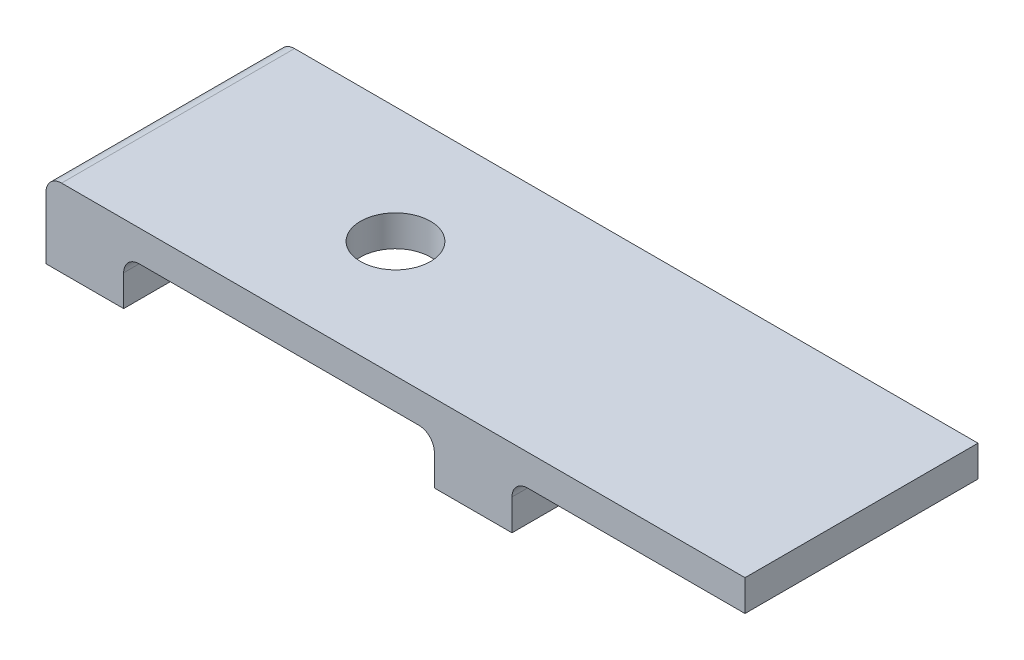
ISO-10303-21;
HEADER;
FILE_DESCRIPTION(('STEP AP214'),'2;1');
FILE_NAME('part.step','',(''),(''),'','','');
FILE_SCHEMA(('AUTOMOTIVE_DESIGN { 1 0 10303 214 1 1 1 1 }'));
ENDSEC;
DATA;
#1=APPLICATION_CONTEXT('core data for automotive mechanical design processes');
#2=APPLICATION_PROTOCOL_DEFINITION('international standard','automotive_design',2000,#1);
#3=PRODUCT_CONTEXT('',#1,'mechanical');
#4=PRODUCT('Part','Part','',(#3));
#5=PRODUCT_RELATED_PRODUCT_CATEGORY('part','',(#4));
#6=PRODUCT_DEFINITION_FORMATION('','',#4);
#7=PRODUCT_DEFINITION_CONTEXT('part definition',#1,'design');
#8=PRODUCT_DEFINITION('design','',#6,#7);
#9=PRODUCT_DEFINITION_SHAPE('','',#8);
#10=(LENGTH_UNIT() NAMED_UNIT(*) SI_UNIT(.MILLI.,.METRE.));
#11=(NAMED_UNIT(*) PLANE_ANGLE_UNIT() SI_UNIT($,.RADIAN.));
#12=(NAMED_UNIT(*) SI_UNIT($,.STERADIAN.) SOLID_ANGLE_UNIT());
#13=UNCERTAINTY_MEASURE_WITH_UNIT(LENGTH_MEASURE(1.E-05),#10,'distance_accuracy_value','');
#14=(GEOMETRIC_REPRESENTATION_CONTEXT(3) GLOBAL_UNCERTAINTY_ASSIGNED_CONTEXT((#13)) GLOBAL_UNIT_ASSIGNED_CONTEXT((#10,
#11,#12)) REPRESENTATION_CONTEXT('',''));
#15=CARTESIAN_POINT('',(0.,0.,0.));
#16=DIRECTION('',(0.,0.,1.));
#17=DIRECTION('',(1.,0.,0.));
#18=AXIS2_PLACEMENT_3D('',#15,#16,#17);
#19=CARTESIAN_POINT('',(31.,-3.,15.));
#20=DIRECTION('',(0.,0.,-1.));
#21=DIRECTION('',(-1.,0.,0.));
#22=AXIS2_PLACEMENT_3D('',#19,#20,#21);
#23=CYLINDRICAL_SURFACE('',#22,1.);
#24=DIRECTION('',(0.,0.,1.));
#25=VECTOR('',#24,1.);
#26=CARTESIAN_POINT('',(30.,-3.,15.));
#27=LINE('',#26,#25);
#28=CARTESIAN_POINT('',(30.,-3.,0.));
#29=VERTEX_POINT('',#28);
#30=CARTESIAN_POINT('',(30.,-3.,15.));
#31=VERTEX_POINT('',#30);
#32=EDGE_CURVE('E187',#29,#31,#27,.T.);
#33=ORIENTED_EDGE('',*,*,#32,.F.);
#34=CARTESIAN_POINT('',(31.,-3.,0.));
#35=DIRECTION('',(0.,0.,1.));
#36=DIRECTION('',(1.,0.,0.));
#37=AXIS2_PLACEMENT_3D('',#34,#35,#36);
#38=CIRCLE('',#37,1.);
#39=CARTESIAN_POINT('',(31.,-2.,0.));
#40=VERTEX_POINT('',#39);
#41=EDGE_CURVE('E39',#29,#40,#38,.F.);
#42=ORIENTED_EDGE('',*,*,#41,.T.);
#43=DIRECTION('',(0.,0.,1.));
#44=VECTOR('',#43,1.);
#45=CARTESIAN_POINT('',(31.,-2.,15.));
#46=LINE('',#45,#44);
#47=CARTESIAN_POINT('',(31.,-2.,15.));
#48=VERTEX_POINT('',#47);
#49=EDGE_CURVE('E190',#48,#40,#46,.F.);
#50=ORIENTED_EDGE('',*,*,#49,.F.);
#51=CARTESIAN_POINT('',(31.,-3.,15.));
#52=DIRECTION('',(0.,0.,1.));
#53=DIRECTION('',(1.,0.,0.));
#54=AXIS2_PLACEMENT_3D('',#51,#52,#53);
#55=CIRCLE('',#54,1.);
#56=EDGE_CURVE('E11',#48,#31,#55,.T.);
#57=ORIENTED_EDGE('',*,*,#56,.T.);
#58=EDGE_LOOP('',(#33,#42,#50,#57));
#59=FACE_BOUND('',#58,.T.);
#60=ADVANCED_FACE('F32',(#59),#23,.F.);
#61=CARTESIAN_POINT('',(24.,-3.,15.));
#62=DIRECTION('',(0.,0.,-1.));
#63=DIRECTION('',(-1.,0.,0.));
#64=AXIS2_PLACEMENT_3D('',#61,#62,#63);
#65=CYLINDRICAL_SURFACE('',#64,1.);
#66=DIRECTION('',(0.,0.,1.));
#67=VECTOR('',#66,1.);
#68=CARTESIAN_POINT('',(24.,-2.,15.));
#69=LINE('',#68,#67);
#70=CARTESIAN_POINT('',(24.,-2.,0.));
#71=VERTEX_POINT('',#70);
#72=CARTESIAN_POINT('',(24.,-2.,15.));
#73=VERTEX_POINT('',#72);
#74=EDGE_CURVE('E177',#71,#73,#69,.T.);
#75=ORIENTED_EDGE('',*,*,#74,.F.);
#76=CARTESIAN_POINT('',(24.,-3.,0.));
#77=DIRECTION('',(0.,0.,1.));
#78=DIRECTION('',(1.,0.,0.));
#79=AXIS2_PLACEMENT_3D('',#76,#77,#78);
#80=CIRCLE('',#79,1.);
#81=CARTESIAN_POINT('',(25.,-3.,0.));
#82=VERTEX_POINT('',#81);
#83=EDGE_CURVE('E183',#71,#82,#80,.F.);
#84=ORIENTED_EDGE('',*,*,#83,.T.);
#85=DIRECTION('',(0.,0.,1.));
#86=VECTOR('',#85,1.);
#87=CARTESIAN_POINT('',(25.,-3.,15.));
#88=LINE('',#87,#86);
#89=CARTESIAN_POINT('',(25.,-3.,15.));
#90=VERTEX_POINT('',#89);
#91=EDGE_CURVE('E180',#90,#82,#88,.F.);
#92=ORIENTED_EDGE('',*,*,#91,.F.);
#93=CARTESIAN_POINT('',(24.,-3.,15.));
#94=DIRECTION('',(0.,0.,1.));
#95=DIRECTION('',(1.,0.,0.));
#96=AXIS2_PLACEMENT_3D('',#93,#94,#95);
#97=CIRCLE('',#96,1.);
#98=EDGE_CURVE('E185',#90,#73,#97,.T.);
#99=ORIENTED_EDGE('',*,*,#98,.T.);
#100=EDGE_LOOP('',(#75,#84,#92,#99));
#101=FACE_BOUND('',#100,.T.);
#102=ADVANCED_FACE('F287',(#101),#65,.F.);
#103=CARTESIAN_POINT('',(6.,-3.,15.));
#104=DIRECTION('',(0.,0.,-1.));
#105=DIRECTION('',(-1.,0.,0.));
#106=AXIS2_PLACEMENT_3D('',#103,#104,#105);
#107=CYLINDRICAL_SURFACE('',#106,1.);
#108=DIRECTION('',(0.,0.,1.));
#109=VECTOR('',#108,1.);
#110=CARTESIAN_POINT('',(5.,-3.,15.));
#111=LINE('',#110,#109);
#112=CARTESIAN_POINT('',(5.,-3.,0.));
#113=VERTEX_POINT('',#112);
#114=CARTESIAN_POINT('',(5.,-3.,15.));
#115=VERTEX_POINT('',#114);
#116=EDGE_CURVE('E167',#113,#115,#111,.T.);
#117=ORIENTED_EDGE('',*,*,#116,.F.);
#118=CARTESIAN_POINT('',(6.,-3.,0.));
#119=DIRECTION('',(0.,0.,1.));
#120=DIRECTION('',(1.,0.,0.));
#121=AXIS2_PLACEMENT_3D('',#118,#119,#120);
#122=CIRCLE('',#121,1.);
#123=CARTESIAN_POINT('',(6.,-2.,0.));
#124=VERTEX_POINT('',#123);
#125=EDGE_CURVE('E173',#113,#124,#122,.F.);
#126=ORIENTED_EDGE('',*,*,#125,.T.);
#127=DIRECTION('',(0.,0.,1.));
#128=VECTOR('',#127,1.);
#129=CARTESIAN_POINT('',(6.,-2.,15.));
#130=LINE('',#129,#128);
#131=CARTESIAN_POINT('',(6.,-2.,15.));
#132=VERTEX_POINT('',#131);
#133=EDGE_CURVE('E170',#132,#124,#130,.F.);
#134=ORIENTED_EDGE('',*,*,#133,.F.);
#135=CARTESIAN_POINT('',(6.,-3.,15.));
#136=DIRECTION('',(0.,0.,1.));
#137=DIRECTION('',(1.,0.,0.));
#138=AXIS2_PLACEMENT_3D('',#135,#136,#137);
#139=CIRCLE('',#138,1.);
#140=EDGE_CURVE('E175',#132,#115,#139,.T.);
#141=ORIENTED_EDGE('',*,*,#140,.T.);
#142=EDGE_LOOP('',(#117,#126,#134,#141));
#143=FACE_BOUND('',#142,.T.);
#144=ADVANCED_FACE('F280',(#143),#107,.F.);
#145=CARTESIAN_POINT('',(1.,-1.,15.));
#146=DIRECTION('',(0.,0.,-1.));
#147=DIRECTION('',(-1.,0.,0.));
#148=AXIS2_PLACEMENT_3D('',#145,#146,#147);
#149=CYLINDRICAL_SURFACE('',#148,1.);
#150=DIRECTION('',(0.,0.,-1.));
#151=VECTOR('',#150,1.);
#152=CARTESIAN_POINT('',(0.,-1.,15.));
#153=LINE('',#152,#151);
#154=CARTESIAN_POINT('',(0.,-1.,15.));
#155=VERTEX_POINT('',#154);
#156=CARTESIAN_POINT('',(0.,-1.,0.));
#157=VERTEX_POINT('',#156);
#158=EDGE_CURVE('E154',#155,#157,#153,.T.);
#159=ORIENTED_EDGE('',*,*,#158,.F.);
#160=CARTESIAN_POINT('',(1.,-1.,15.));
#161=DIRECTION('',(0.,0.,1.));
#162=DIRECTION('',(1.,0.,0.));
#163=AXIS2_PLACEMENT_3D('',#160,#161,#162);
#164=CIRCLE('',#163,1.);
#165=CARTESIAN_POINT('',(1.,0.,15.));
#166=VERTEX_POINT('',#165);
#167=EDGE_CURVE('E134',#166,#155,#164,.T.);
#168=ORIENTED_EDGE('',*,*,#167,.F.);
#169=DIRECTION('',(0.,0.,-1.));
#170=VECTOR('',#169,1.);
#171=CARTESIAN_POINT('',(1.,0.,15.));
#172=LINE('',#171,#170);
#173=CARTESIAN_POINT('',(1.,0.,0.));
#174=VERTEX_POINT('',#173);
#175=EDGE_CURVE('E156',#174,#166,#172,.F.);
#176=ORIENTED_EDGE('',*,*,#175,.F.);
#177=CARTESIAN_POINT('',(1.,-1.,0.));
#178=DIRECTION('',(0.,0.,1.));
#179=DIRECTION('',(1.,0.,0.));
#180=AXIS2_PLACEMENT_3D('',#177,#178,#179);
#181=CIRCLE('',#180,1.);
#182=EDGE_CURVE('E165',#157,#174,#181,.F.);
#183=ORIENTED_EDGE('',*,*,#182,.F.);
#184=EDGE_LOOP('',(#159,#168,#176,#183));
#185=FACE_BOUND('',#184,.T.);
#186=ADVANCED_FACE('F278',(#185),#149,.T.);
#187=CARTESIAN_POINT('',(0.,0.,15.));
#188=DIRECTION('',(1.,0.,0.));
#189=DIRECTION('',(0.,1.,0.));
#190=AXIS2_PLACEMENT_3D('',#187,#188,#189);
#191=PLANE('',#190);
#192=DIRECTION('',(0.,-1.,0.));
#193=VECTOR('',#192,1.);
#194=CARTESIAN_POINT('',(0.,0.,15.));
#195=LINE('',#194,#193);
#196=CARTESIAN_POINT('',(0.,-5.,15.));
#197=VERTEX_POINT('',#196);
#198=EDGE_CURVE('E127',#155,#197,#195,.T.);
#199=ORIENTED_EDGE('',*,*,#198,.F.);
#200=ORIENTED_EDGE('',*,*,#158,.T.);
#201=DIRECTION('',(0.,-1.,0.));
#202=VECTOR('',#201,1.);
#203=CARTESIAN_POINT('',(0.,0.,0.));
#204=LINE('',#203,#202);
#205=CARTESIAN_POINT('',(0.,-5.,0.));
#206=VERTEX_POINT('',#205);
#207=EDGE_CURVE('E152',#157,#206,#204,.T.);
#208=ORIENTED_EDGE('',*,*,#207,.T.);
#209=DIRECTION('',(0.,0.,-1.));
#210=VECTOR('',#209,1.);
#211=CARTESIAN_POINT('',(0.,-5.,15.));
#212=LINE('',#211,#210);
#213=EDGE_CURVE('E144',#197,#206,#212,.T.);
#214=ORIENTED_EDGE('',*,*,#213,.F.);
#215=EDGE_LOOP('',(#199,#200,#208,#214));
#216=FACE_BOUND('',#215,.T.);
#217=ADVANCED_FACE('F150',(#216),#191,.F.);
#218=CARTESIAN_POINT('',(0.,-5.,15.));
#219=DIRECTION('',(0.,1.,0.));
#220=DIRECTION('',(0.,0.,1.));
#221=AXIS2_PLACEMENT_3D('',#218,#219,#220);
#222=PLANE('',#221);
#223=DIRECTION('',(1.,0.,0.));
#224=VECTOR('',#223,1.);
#225=CARTESIAN_POINT('',(0.,-5.,0.));
#226=LINE('',#225,#224);
#227=CARTESIAN_POINT('',(5.,-5.,0.));
#228=VERTEX_POINT('',#227);
#229=EDGE_CURVE('E243',#206,#228,#226,.T.);
#230=ORIENTED_EDGE('',*,*,#229,.T.);
#231=DIRECTION('',(0.,0.,-1.));
#232=VECTOR('',#231,1.);
#233=CARTESIAN_POINT('',(5.,-5.,15.));
#234=LINE('',#233,#232);
#235=CARTESIAN_POINT('',(5.,-5.,15.));
#236=VERTEX_POINT('',#235);
#237=EDGE_CURVE('E146',#236,#228,#234,.T.);
#238=ORIENTED_EDGE('',*,*,#237,.F.);
#239=DIRECTION('',(1.,0.,0.));
#240=VECTOR('',#239,1.);
#241=CARTESIAN_POINT('',(0.,-5.,15.));
#242=LINE('',#241,#240);
#243=EDGE_CURVE('E131',#197,#236,#242,.T.);
#244=ORIENTED_EDGE('',*,*,#243,.F.);
#245=ORIENTED_EDGE('',*,*,#213,.T.);
#246=EDGE_LOOP('',(#230,#238,#244,#245));
#247=FACE_BOUND('',#246,.T.);
#248=ADVANCED_FACE('F143',(#247),#222,.F.);
#249=CARTESIAN_POINT('',(5.,-5.,15.));
#250=DIRECTION('',(-1.,0.,0.));
#251=DIRECTION('',(0.,0.,1.));
#252=AXIS2_PLACEMENT_3D('',#249,#250,#251);
#253=PLANE('',#252);
#254=DIRECTION('',(0.,1.,0.));
#255=VECTOR('',#254,1.);
#256=CARTESIAN_POINT('',(5.,-5.,0.));
#257=LINE('',#256,#255);
#258=EDGE_CURVE('E240',#228,#113,#257,.T.);
#259=ORIENTED_EDGE('',*,*,#258,.T.);
#260=ORIENTED_EDGE('',*,*,#116,.T.);
#261=DIRECTION('',(0.,1.,0.));
#262=VECTOR('',#261,1.);
#263=CARTESIAN_POINT('',(5.,-5.,15.));
#264=LINE('',#263,#262);
#265=EDGE_CURVE('E148',#236,#115,#264,.T.);
#266=ORIENTED_EDGE('',*,*,#265,.F.);
#267=ORIENTED_EDGE('',*,*,#237,.T.);
#268=EDGE_LOOP('',(#259,#260,#266,#267));
#269=FACE_BOUND('',#268,.T.);
#270=ADVANCED_FACE('F309',(#269),#253,.F.);
#271=CARTESIAN_POINT('',(5.,-2.,15.));
#272=DIRECTION('',(0.,1.,0.));
#273=DIRECTION('',(0.,0.,1.));
#274=AXIS2_PLACEMENT_3D('',#271,#272,#273);
#275=PLANE('',#274);
#276=CARTESIAN_POINT('',(15.,-2.,7.5));
#277=DIRECTION('',(0.,1.,0.));
#278=DIRECTION('',(0.,0.,1.));
#279=AXIS2_PLACEMENT_3D('',#276,#277,#278);
#280=CIRCLE('',#279,2.25);
#281=CARTESIAN_POINT('',(15.,-2.,9.75));
#282=VERTEX_POINT('',#281);
#283=EDGE_CURVE('E246',#282,#282,#280,.T.);
#284=ORIENTED_EDGE('',*,*,#283,.T.);
#285=EDGE_LOOP('',(#284));
#286=FACE_BOUND('',#285,.T.);
#287=DIRECTION('',(1.,0.,0.));
#288=VECTOR('',#287,1.);
#289=CARTESIAN_POINT('',(5.,-2.,0.));
#290=LINE('',#289,#288);
#291=EDGE_CURVE('E235',#124,#71,#290,.T.);
#292=ORIENTED_EDGE('',*,*,#291,.T.);
#293=ORIENTED_EDGE('',*,*,#74,.T.);
#294=DIRECTION('',(1.,0.,0.));
#295=VECTOR('',#294,1.);
#296=CARTESIAN_POINT('',(5.,-2.,15.));
#297=LINE('',#296,#295);
#298=EDGE_CURVE('E256',#132,#73,#297,.T.);
#299=ORIENTED_EDGE('',*,*,#298,.F.);
#300=ORIENTED_EDGE('',*,*,#133,.T.);
#301=EDGE_LOOP('',(#292,#293,#299,#300));
#302=FACE_BOUND('',#301,.T.);
#303=ADVANCED_FACE('F305',(#286,#302),#275,.F.);
#304=CARTESIAN_POINT('',(25.,-2.,15.));
#305=DIRECTION('',(1.,0.,0.));
#306=DIRECTION('',(0.,0.,-1.));
#307=AXIS2_PLACEMENT_3D('',#304,#305,#306);
#308=PLANE('',#307);
#309=DIRECTION('',(0.,-1.,0.));
#310=VECTOR('',#309,1.);
#311=CARTESIAN_POINT('',(25.,-2.,15.));
#312=LINE('',#311,#310);
#313=CARTESIAN_POINT('',(25.,-5.,15.));
#314=VERTEX_POINT('',#313);
#315=EDGE_CURVE('E254',#90,#314,#312,.T.);
#316=ORIENTED_EDGE('',*,*,#315,.F.);
#317=ORIENTED_EDGE('',*,*,#91,.T.);
#318=DIRECTION('',(0.,-1.,0.));
#319=VECTOR('',#318,1.);
#320=CARTESIAN_POINT('',(25.,-2.,0.));
#321=LINE('',#320,#319);
#322=CARTESIAN_POINT('',(25.,-5.,0.));
#323=VERTEX_POINT('',#322);
#324=EDGE_CURVE('E234',#82,#323,#321,.T.);
#325=ORIENTED_EDGE('',*,*,#324,.T.);
#326=DIRECTION('',(0.,0.,-1.));
#327=VECTOR('',#326,1.);
#328=CARTESIAN_POINT('',(25.,-5.,15.));
#329=LINE('',#328,#327);
#330=EDGE_CURVE('E158',#314,#323,#329,.T.);
#331=ORIENTED_EDGE('',*,*,#330,.F.);
#332=EDGE_LOOP('',(#316,#317,#325,#331));
#333=FACE_BOUND('',#332,.T.);
#334=ADVANCED_FACE('F299',(#333),#308,.F.);
#335=CARTESIAN_POINT('',(25.,-5.,15.));
#336=DIRECTION('',(0.,1.,0.));
#337=DIRECTION('',(0.,0.,1.));
#338=AXIS2_PLACEMENT_3D('',#335,#336,#337);
#339=PLANE('',#338);
#340=DIRECTION('',(1.,0.,0.));
#341=VECTOR('',#340,1.);
#342=CARTESIAN_POINT('',(25.,-5.,0.));
#343=LINE('',#342,#341);
#344=CARTESIAN_POINT('',(30.,-5.,0.));
#345=VERTEX_POINT('',#344);
#346=EDGE_CURVE('E209',#323,#345,#343,.T.);
#347=ORIENTED_EDGE('',*,*,#346,.T.);
#348=DIRECTION('',(0.,0.,-1.));
#349=VECTOR('',#348,1.);
#350=CARTESIAN_POINT('',(30.,-5.,15.));
#351=LINE('',#350,#349);
#352=CARTESIAN_POINT('',(30.,-5.,15.));
#353=VERTEX_POINT('',#352);
#354=EDGE_CURVE('E221',#353,#345,#351,.T.);
#355=ORIENTED_EDGE('',*,*,#354,.F.);
#356=DIRECTION('',(1.,0.,0.));
#357=VECTOR('',#356,1.);
#358=CARTESIAN_POINT('',(25.,-5.,15.));
#359=LINE('',#358,#357);
#360=EDGE_CURVE('E230',#314,#353,#359,.T.);
#361=ORIENTED_EDGE('',*,*,#360,.F.);
#362=ORIENTED_EDGE('',*,*,#330,.T.);
#363=EDGE_LOOP('',(#347,#355,#361,#362));
#364=FACE_BOUND('',#363,.T.);
#365=ADVANCED_FACE('F228',(#364),#339,.F.);
#366=CARTESIAN_POINT('',(30.,-5.,15.));
#367=DIRECTION('',(-1.,0.,0.));
#368=DIRECTION('',(0.,0.,1.));
#369=AXIS2_PLACEMENT_3D('',#366,#367,#368);
#370=PLANE('',#369);
#371=DIRECTION('',(0.,1.,0.));
#372=VECTOR('',#371,1.);
#373=CARTESIAN_POINT('',(30.,-5.,0.));
#374=LINE('',#373,#372);
#375=EDGE_CURVE('E205',#345,#29,#374,.T.);
#376=ORIENTED_EDGE('',*,*,#375,.T.);
#377=ORIENTED_EDGE('',*,*,#32,.T.);
#378=DIRECTION('',(0.,1.,0.));
#379=VECTOR('',#378,1.);
#380=CARTESIAN_POINT('',(30.,-5.,15.));
#381=LINE('',#380,#379);
#382=EDGE_CURVE('E251',#353,#31,#381,.T.);
#383=ORIENTED_EDGE('',*,*,#382,.F.);
#384=ORIENTED_EDGE('',*,*,#354,.T.);
#385=EDGE_LOOP('',(#376,#377,#383,#384));
#386=FACE_BOUND('',#385,.T.);
#387=ADVANCED_FACE('F297',(#386),#370,.F.);
#388=CARTESIAN_POINT('',(30.,-2.,15.));
#389=DIRECTION('',(0.,1.,0.));
#390=DIRECTION('',(0.,0.,1.));
#391=AXIS2_PLACEMENT_3D('',#388,#389,#390);
#392=PLANE('',#391);
#393=DIRECTION('',(1.,0.,0.));
#394=VECTOR('',#393,1.);
#395=CARTESIAN_POINT('',(30.,-2.,15.));
#396=LINE('',#395,#394);
#397=CARTESIAN_POINT('',(45.,-2.,15.));
#398=VERTEX_POINT('',#397);
#399=EDGE_CURVE('E198',#48,#398,#396,.T.);
#400=ORIENTED_EDGE('',*,*,#399,.F.);
#401=ORIENTED_EDGE('',*,*,#49,.T.);
#402=DIRECTION('',(1.,0.,0.));
#403=VECTOR('',#402,1.);
#404=CARTESIAN_POINT('',(30.,-2.,0.));
#405=LINE('',#404,#403);
#406=CARTESIAN_POINT('',(45.,-2.,0.));
#407=VERTEX_POINT('',#406);
#408=EDGE_CURVE('E196',#40,#407,#405,.T.);
#409=ORIENTED_EDGE('',*,*,#408,.T.);
#410=DIRECTION('',(0.,0.,-1.));
#411=VECTOR('',#410,1.);
#412=CARTESIAN_POINT('',(45.,-2.,15.));
#413=LINE('',#412,#411);
#414=EDGE_CURVE('E218',#398,#407,#413,.T.);
#415=ORIENTED_EDGE('',*,*,#414,.F.);
#416=EDGE_LOOP('',(#400,#401,#409,#415));
#417=FACE_BOUND('',#416,.T.);
#418=ADVANCED_FACE('F194',(#417),#392,.F.);
#419=CARTESIAN_POINT('',(45.,-2.,15.));
#420=DIRECTION('',(-1.,0.,0.));
#421=DIRECTION('',(0.,0.,1.));
#422=AXIS2_PLACEMENT_3D('',#419,#420,#421);
#423=PLANE('',#422);
#424=DIRECTION('',(0.,1.,0.));
#425=VECTOR('',#424,1.);
#426=CARTESIAN_POINT('',(45.,-2.,0.));
#427=LINE('',#426,#425);
#428=CARTESIAN_POINT('',(45.,0.,0.));
#429=VERTEX_POINT('',#428);
#430=EDGE_CURVE('E204',#407,#429,#427,.T.);
#431=ORIENTED_EDGE('',*,*,#430,.T.);
#432=DIRECTION('',(0.,0.,-1.));
#433=VECTOR('',#432,1.);
#434=CARTESIAN_POINT('',(45.,0.,15.));
#435=LINE('',#434,#433);
#436=CARTESIAN_POINT('',(45.,0.,15.));
#437=VERTEX_POINT('',#436);
#438=EDGE_CURVE('E215',#437,#429,#435,.T.);
#439=ORIENTED_EDGE('',*,*,#438,.F.);
#440=DIRECTION('',(0.,1.,0.));
#441=VECTOR('',#440,1.);
#442=CARTESIAN_POINT('',(45.,-2.,15.));
#443=LINE('',#442,#441);
#444=EDGE_CURVE('E248',#398,#437,#443,.T.);
#445=ORIENTED_EDGE('',*,*,#444,.F.);
#446=ORIENTED_EDGE('',*,*,#414,.T.);
#447=EDGE_LOOP('',(#431,#439,#445,#446));
#448=FACE_BOUND('',#447,.T.);
#449=ADVANCED_FACE('F272',(#448),#423,.F.);
#450=CARTESIAN_POINT('',(0.,0.,15.));
#451=DIRECTION('',(0.,-1.,0.));
#452=DIRECTION('',(0.,0.,-1.));
#453=AXIS2_PLACEMENT_3D('',#450,#451,#452);
#454=PLANE('',#453);
#455=CARTESIAN_POINT('',(15.,0.,7.5));
#456=DIRECTION('',(0.,1.,0.));
#457=DIRECTION('',(0.,0.,1.));
#458=AXIS2_PLACEMENT_3D('',#455,#456,#457);
#459=CIRCLE('',#458,2.25);
#460=CARTESIAN_POINT('',(15.,0.,9.75));
#461=VERTEX_POINT('',#460);
#462=EDGE_CURVE('E262',#461,#461,#459,.T.);
#463=ORIENTED_EDGE('',*,*,#462,.F.);
#464=EDGE_LOOP('',(#463));
#465=FACE_BOUND('',#464,.T.);
#466=DIRECTION('',(-1.,0.,0.));
#467=VECTOR('',#466,1.);
#468=CARTESIAN_POINT('',(0.,0.,0.));
#469=LINE('',#468,#467);
#470=EDGE_CURVE('E139',#429,#174,#469,.T.);
#471=ORIENTED_EDGE('',*,*,#470,.T.);
#472=ORIENTED_EDGE('',*,*,#175,.T.);
#473=DIRECTION('',(-1.,0.,0.));
#474=VECTOR('',#473,1.);
#475=CARTESIAN_POINT('',(0.,0.,15.));
#476=LINE('',#475,#474);
#477=EDGE_CURVE('E219',#437,#166,#476,.T.);
#478=ORIENTED_EDGE('',*,*,#477,.F.);
#479=ORIENTED_EDGE('',*,*,#438,.T.);
#480=EDGE_LOOP('',(#471,#472,#478,#479));
#481=FACE_BOUND('',#480,.T.);
#482=ADVANCED_FACE('F269',(#465,#481),#454,.F.);
#483=CARTESIAN_POINT('',(0.,0.,15.));
#484=DIRECTION('',(0.,0.,1.));
#485=DIRECTION('',(1.,0.,0.));
#486=AXIS2_PLACEMENT_3D('',#483,#484,#485);
#487=PLANE('',#486);
#488=ORIENTED_EDGE('',*,*,#56,.F.);
#489=ORIENTED_EDGE('',*,*,#399,.T.);
#490=ORIENTED_EDGE('',*,*,#444,.T.);
#491=ORIENTED_EDGE('',*,*,#477,.T.);
#492=ORIENTED_EDGE('',*,*,#167,.T.);
#493=ORIENTED_EDGE('',*,*,#198,.T.);
#494=ORIENTED_EDGE('',*,*,#243,.T.);
#495=ORIENTED_EDGE('',*,*,#265,.T.);
#496=ORIENTED_EDGE('',*,*,#140,.F.);
#497=ORIENTED_EDGE('',*,*,#298,.T.);
#498=ORIENTED_EDGE('',*,*,#98,.F.);
#499=ORIENTED_EDGE('',*,*,#315,.T.);
#500=ORIENTED_EDGE('',*,*,#360,.T.);
#501=ORIENTED_EDGE('',*,*,#382,.T.);
#502=EDGE_LOOP('',(#488,#489,#490,#491,#492,#493,#494,#495,#496,#497,#498,#499,#500,#501));
#503=FACE_BOUND('',#502,.T.);
#504=ADVANCED_FACE('F129',(#503),#487,.T.);
#505=CARTESIAN_POINT('',(0.,0.,0.));
#506=DIRECTION('',(0.,0.,1.));
#507=DIRECTION('',(1.,0.,0.));
#508=AXIS2_PLACEMENT_3D('',#505,#506,#507);
#509=PLANE('',#508);
#510=ORIENTED_EDGE('',*,*,#207,.F.);
#511=ORIENTED_EDGE('',*,*,#182,.T.);
#512=ORIENTED_EDGE('',*,*,#470,.F.);
#513=ORIENTED_EDGE('',*,*,#430,.F.);
#514=ORIENTED_EDGE('',*,*,#408,.F.);
#515=ORIENTED_EDGE('',*,*,#41,.F.);
#516=ORIENTED_EDGE('',*,*,#375,.F.);
#517=ORIENTED_EDGE('',*,*,#346,.F.);
#518=ORIENTED_EDGE('',*,*,#324,.F.);
#519=ORIENTED_EDGE('',*,*,#83,.F.);
#520=ORIENTED_EDGE('',*,*,#291,.F.);
#521=ORIENTED_EDGE('',*,*,#125,.F.);
#522=ORIENTED_EDGE('',*,*,#258,.F.);
#523=ORIENTED_EDGE('',*,*,#229,.F.);
#524=EDGE_LOOP('',(#510,#511,#512,#513,#514,#515,#516,#517,#518,#519,#520,#521,#522,#523));
#525=FACE_BOUND('',#524,.T.);
#526=ADVANCED_FACE('F201',(#525),#509,.F.);
#527=CARTESIAN_POINT('',(15.,-5.,7.5));
#528=DIRECTION('',(0.,1.,0.));
#529=DIRECTION('',(0.,0.,1.));
#530=AXIS2_PLACEMENT_3D('',#527,#528,#529);
#531=CYLINDRICAL_SURFACE('',#530,2.25);
#532=ORIENTED_EDGE('',*,*,#462,.T.);
#533=EDGE_LOOP('',(#532));
#534=FACE_BOUND('',#533,.T.);
#535=ORIENTED_EDGE('',*,*,#283,.F.);
#536=EDGE_LOOP('',(#535));
#537=FACE_BOUND('',#536,.T.);
#538=ADVANCED_FACE('F266',(#534,#537),#531,.F.);
#539=CLOSED_SHELL('',(#60,#102,#144,#186,#217,#248,#270,#303,#334,#365,#387,#418,#449,#482,#504,
#526,#538));
#540=MANIFOLD_SOLID_BREP('B2',#539);
#541=ADVANCED_BREP_SHAPE_REPRESENTATION('',(#18,#540),#14);
#542=SHAPE_DEFINITION_REPRESENTATION(#9,#541);
ENDSEC;
END-ISO-10303-21;
